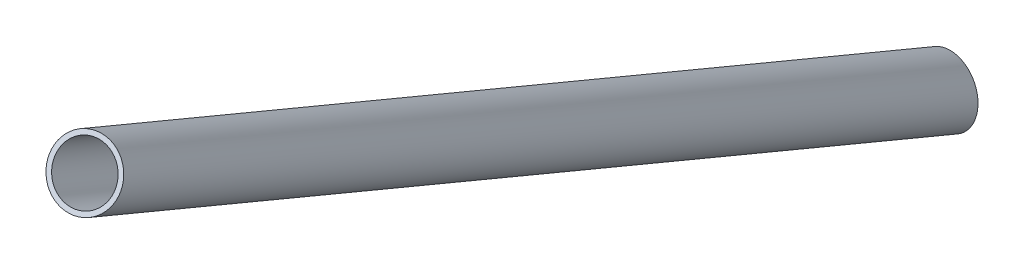
ISO-10303-21;
HEADER;
FILE_DESCRIPTION(('STEP AP214'),'2;1');
FILE_NAME('part.step','',(''),(''),'','','');
FILE_SCHEMA(('AUTOMOTIVE_DESIGN { 1 0 10303 214 1 1 1 1 }'));
ENDSEC;
DATA;
#1=APPLICATION_CONTEXT('core data for automotive mechanical design processes');
#2=APPLICATION_PROTOCOL_DEFINITION('international standard','automotive_design',2000,#1);
#3=PRODUCT_CONTEXT('',#1,'mechanical');
#4=PRODUCT('Part','Part','',(#3));
#5=PRODUCT_RELATED_PRODUCT_CATEGORY('part','',(#4));
#6=PRODUCT_DEFINITION_FORMATION('','',#4);
#7=PRODUCT_DEFINITION_CONTEXT('part definition',#1,'design');
#8=PRODUCT_DEFINITION('design','',#6,#7);
#9=PRODUCT_DEFINITION_SHAPE('','',#8);
#10=(LENGTH_UNIT() NAMED_UNIT(*) SI_UNIT(.MILLI.,.METRE.));
#11=(NAMED_UNIT(*) PLANE_ANGLE_UNIT() SI_UNIT($,.RADIAN.));
#12=(NAMED_UNIT(*) SI_UNIT($,.STERADIAN.) SOLID_ANGLE_UNIT());
#13=UNCERTAINTY_MEASURE_WITH_UNIT(LENGTH_MEASURE(1.E-05),#10,'distance_accuracy_value','');
#14=(GEOMETRIC_REPRESENTATION_CONTEXT(3) GLOBAL_UNCERTAINTY_ASSIGNED_CONTEXT((#13)) GLOBAL_UNIT_ASSIGNED_CONTEXT((#10,
#11,#12)) REPRESENTATION_CONTEXT('',''));
#15=CARTESIAN_POINT('',(0.,0.,0.));
#16=DIRECTION('',(0.,0.,1.));
#17=DIRECTION('',(1.,0.,0.));
#18=AXIS2_PLACEMENT_3D('',#15,#16,#17);
#19=CARTESIAN_POINT('',(225.,200.,-450.000000000001));
#20=DIRECTION('',(-0.173785333909048,-0.463427557090794,-0.868926669545238));
#21=DIRECTION('',(0.,0.882352941176471,-0.470588235294118));
#22=AXIS2_PLACEMENT_3D('',#19,#20,#21);
#23=CYLINDRICAL_SURFACE('',#22,9.39999999999998);
#24=CARTESIAN_POINT('',(225.,200.,-450.000000000001));
#25=DIRECTION('',(0.173785333909048,0.463427557090794,0.868926669545238));
#26=DIRECTION('',(-0.0231066302686451,-0.880191131181345,0.474056596017113));
#27=AXIS2_PLACEMENT_3D('',#24,#25,#26);
#28=CIRCLE('',#27,9.39999999999998);
#29=CARTESIAN_POINT('',(224.782797675475,191.726203366896,-445.54386799744));
#30=VERTEX_POINT('',#29);
#31=EDGE_CURVE('E53',#30,#30,#28,.T.);
#32=ORIENTED_EDGE('',*,*,#31,.T.);
#33=EDGE_LOOP('',(#32));
#34=FACE_BOUND('',#33,.T.);
#35=CARTESIAN_POINT('',(150.,4.9960036108132E-13,-825.));
#36=DIRECTION('',(0.0197141066523152,-0.0461644942318042,-0.998739302055958));
#37=DIRECTION('',(-0.412111349099456,-0.910500714966001,0.0339512001235188));
#38=AXIS2_PLACEMENT_3D('',#35,#36,#37);
#39=ELLIPSE('',#38,10.6118871519751,9.39999999999998);
#40=CARTESIAN_POINT('',(145.626720869308,-9.66213083901134,-824.639713695615));
#41=VERTEX_POINT('',#40);
#42=EDGE_CURVE('E43',#41,#41,#39,.T.);
#43=ORIENTED_EDGE('',*,*,#42,.T.);
#44=EDGE_LOOP('',(#43));
#45=FACE_BOUND('',#44,.T.);
#46=ADVANCED_FACE('F39',(#34,#45),#23,.F.);
#47=CARTESIAN_POINT('',(225.,200.,-450.000000000001));
#48=DIRECTION('',(-0.173785333909048,-0.463427557090794,-0.868926669545238));
#49=DIRECTION('',(0.,0.882352941176471,-0.470588235294118));
#50=AXIS2_PLACEMENT_3D('',#47,#48,#49);
#51=CYLINDRICAL_SURFACE('',#50,11.);
#52=CARTESIAN_POINT('',(225.,200.,-450.000000000001));
#53=DIRECTION('',(0.173785333909048,0.463427557090794,0.868926669545238));
#54=DIRECTION('',(-0.0231066302686451,-0.880191131181345,0.474056596017113));
#55=AXIS2_PLACEMENT_3D('',#52,#53,#54);
#56=CIRCLE('',#55,11.);
#57=CARTESIAN_POINT('',(224.745827067045,190.317897557005,-444.785377443812));
#58=VERTEX_POINT('',#57);
#59=EDGE_CURVE('E47',#58,#58,#56,.T.);
#60=ORIENTED_EDGE('',*,*,#59,.F.);
#61=EDGE_LOOP('',(#60));
#62=FACE_BOUND('',#61,.T.);
#63=CARTESIAN_POINT('',(150.,4.9960036108132E-13,-825.));
#64=DIRECTION('',(0.0197141066523152,-0.0461644942318042,-0.998739302055958));
#65=DIRECTION('',(-0.412111349099456,-0.910500714966001,0.0339512001235188));
#66=AXIS2_PLACEMENT_3D('',#63,#64,#65);
#67=ELLIPSE('',#66,12.4181658161411,11.);
#68=CARTESIAN_POINT('',(144.882332932169,-11.3067488541623,-824.578388367209));
#69=VERTEX_POINT('',#68);
#70=EDGE_CURVE('E10',#69,#69,#67,.T.);
#71=ORIENTED_EDGE('',*,*,#70,.F.);
#72=EDGE_LOOP('',(#71));
#73=FACE_BOUND('',#72,.T.);
#74=ADVANCED_FACE('F67',(#62,#73),#51,.T.);
#75=CARTESIAN_POINT('',(225.,200.,-450.000000000001));
#76=DIRECTION('',(0.173785333909048,0.463427557090794,0.868926669545238));
#77=DIRECTION('',(-0.0231066302686451,-0.880191131181345,0.474056596017113));
#78=AXIS2_PLACEMENT_3D('',#75,#76,#77);
#79=PLANE('',#78);
#80=ORIENTED_EDGE('',*,*,#31,.F.);
#81=EDGE_LOOP('',(#80));
#82=FACE_BOUND('',#81,.T.);
#83=ORIENTED_EDGE('',*,*,#59,.T.);
#84=EDGE_LOOP('',(#83));
#85=FACE_BOUND('',#84,.T.);
#86=ADVANCED_FACE('F62',(#82,#85),#79,.T.);
#87=CARTESIAN_POINT('',(150.,0.,-825.));
#88=DIRECTION('',(0.0197141066523152,-0.0461644942318042,-0.998739302055958));
#89=DIRECTION('',(0.,0.998933436662963,-0.0461734676705452));
#90=AXIS2_PLACEMENT_3D('',#87,#88,#89);
#91=PLANE('',#90);
#92=ORIENTED_EDGE('',*,*,#42,.F.);
#93=EDGE_LOOP('',(#92));
#94=FACE_BOUND('',#93,.T.);
#95=ORIENTED_EDGE('',*,*,#70,.T.);
#96=EDGE_LOOP('',(#95));
#97=FACE_BOUND('',#96,.T.);
#98=ADVANCED_FACE('F41',(#94,#97),#91,.T.);
#99=CLOSED_SHELL('',(#46,#74,#86,#98));
#100=MANIFOLD_SOLID_BREP('B2',#99);
#101=ADVANCED_BREP_SHAPE_REPRESENTATION('',(#18,#100),#14);
#102=SHAPE_DEFINITION_REPRESENTATION(#9,#101);
ENDSEC;
END-ISO-10303-21;
